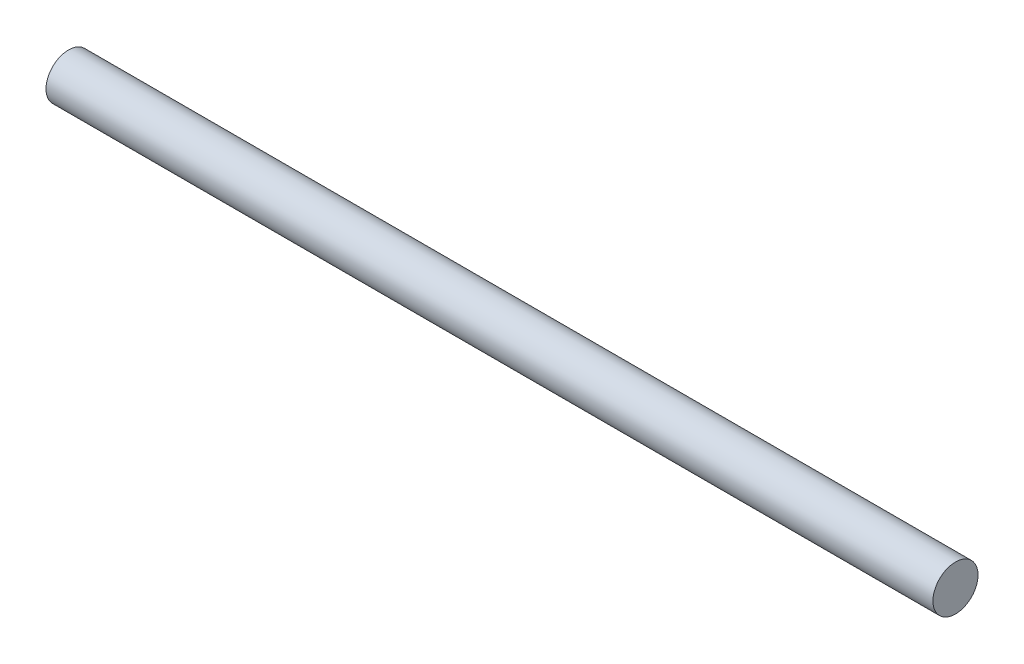
ISO-10303-21;
HEADER;
FILE_DESCRIPTION(('STEP AP214'),'2;1');
FILE_NAME('part.step','',(''),(''),'','','');
FILE_SCHEMA(('AUTOMOTIVE_DESIGN { 1 0 10303 214 1 1 1 1 }'));
ENDSEC;
DATA;
#1=APPLICATION_CONTEXT('core data for automotive mechanical design processes');
#2=APPLICATION_PROTOCOL_DEFINITION('international standard','automotive_design',2000,#1);
#3=PRODUCT_CONTEXT('',#1,'mechanical');
#4=PRODUCT('Part','Part','',(#3));
#5=PRODUCT_RELATED_PRODUCT_CATEGORY('part','',(#4));
#6=PRODUCT_DEFINITION_FORMATION('','',#4);
#7=PRODUCT_DEFINITION_CONTEXT('part definition',#1,'design');
#8=PRODUCT_DEFINITION('design','',#6,#7);
#9=PRODUCT_DEFINITION_SHAPE('','',#8);
#10=(LENGTH_UNIT() NAMED_UNIT(*) SI_UNIT(.MILLI.,.METRE.));
#11=(NAMED_UNIT(*) PLANE_ANGLE_UNIT() SI_UNIT($,.RADIAN.));
#12=(NAMED_UNIT(*) SI_UNIT($,.STERADIAN.) SOLID_ANGLE_UNIT());
#13=UNCERTAINTY_MEASURE_WITH_UNIT(LENGTH_MEASURE(1.E-05),#10,'distance_accuracy_value','');
#14=(GEOMETRIC_REPRESENTATION_CONTEXT(3) GLOBAL_UNCERTAINTY_ASSIGNED_CONTEXT((#13)) GLOBAL_UNIT_ASSIGNED_CONTEXT((#10,
#11,#12)) REPRESENTATION_CONTEXT('',''));
#15=CARTESIAN_POINT('',(0.,0.,0.));
#16=DIRECTION('',(0.,0.,1.));
#17=DIRECTION('',(1.,0.,0.));
#18=AXIS2_PLACEMENT_3D('',#15,#16,#17);
#19=CARTESIAN_POINT('',(187.24,0.,0.));
#20=DIRECTION('',(-1.,0.,0.));
#21=DIRECTION('',(0.,0.,1.));
#22=AXIS2_PLACEMENT_3D('',#19,#20,#21);
#23=CYLINDRICAL_SURFACE('',#22,4.7625);
#24=CARTESIAN_POINT('',(187.24,0.,0.));
#25=DIRECTION('',(1.,0.,0.));
#26=DIRECTION('',(0.,0.,-1.));
#27=AXIS2_PLACEMENT_3D('',#24,#25,#26);
#28=CIRCLE('',#27,4.7625);
#29=CARTESIAN_POINT('',(187.24,0.,4.7625));
#30=VERTEX_POINT('',#29);
#31=EDGE_CURVE('E10',#30,#30,#28,.T.);
#32=CARTESIAN_POINT('',(0.,0.,0.));
#33=DIRECTION('',(1.,0.,0.));
#34=DIRECTION('',(0.,0.,-1.));
#35=AXIS2_PLACEMENT_3D('',#32,#33,#34);
#36=CIRCLE('',#35,4.7625);
#37=CARTESIAN_POINT('',(0.,0.,4.7625));
#38=VERTEX_POINT('',#37);
#39=EDGE_CURVE('E42',#38,#38,#36,.T.);
#40=CARTESIAN_POINT('',(187.24,0.,4.7625));
#41=CARTESIAN_POINT('',(185.289583333333,0.,4.7625));
#42=CARTESIAN_POINT('',(183.339166666667,0.,4.7625));
#43=CARTESIAN_POINT('',(179.438333333333,0.,4.7625));
#44=CARTESIAN_POINT('',(177.487916666667,0.,4.7625));
#45=CARTESIAN_POINT('',(173.587083333333,0.,4.7625));
#46=CARTESIAN_POINT('',(171.636666666667,0.,4.7625));
#47=CARTESIAN_POINT('',(167.735833333333,0.,4.7625));
#48=CARTESIAN_POINT('',(165.785416666667,0.,4.7625));
#49=CARTESIAN_POINT('',(161.884583333333,0.,4.7625));
#50=CARTESIAN_POINT('',(159.934166666667,0.,4.7625));
#51=CARTESIAN_POINT('',(156.033333333333,0.,4.7625));
#52=CARTESIAN_POINT('',(154.082916666667,0.,4.7625));
#53=CARTESIAN_POINT('',(150.182083333333,0.,4.7625));
#54=CARTESIAN_POINT('',(148.231666666667,0.,4.7625));
#55=CARTESIAN_POINT('',(144.330833333333,0.,4.7625));
#56=CARTESIAN_POINT('',(142.380416666667,0.,4.7625));
#57=CARTESIAN_POINT('',(138.479583333333,0.,4.7625));
#58=CARTESIAN_POINT('',(136.529166666667,0.,4.7625));
#59=CARTESIAN_POINT('',(132.628333333333,0.,4.7625));
#60=CARTESIAN_POINT('',(130.677916666667,0.,4.7625));
#61=CARTESIAN_POINT('',(126.777083333333,0.,4.7625));
#62=CARTESIAN_POINT('',(124.826666666667,0.,4.7625));
#63=CARTESIAN_POINT('',(120.925833333333,0.,4.7625));
#64=CARTESIAN_POINT('',(118.975416666667,0.,4.7625));
#65=CARTESIAN_POINT('',(115.074583333333,0.,4.7625));
#66=CARTESIAN_POINT('',(113.124166666667,0.,4.7625));
#67=CARTESIAN_POINT('',(109.223333333333,0.,4.7625));
#68=CARTESIAN_POINT('',(107.272916666667,0.,4.7625));
#69=CARTESIAN_POINT('',(103.372083333333,0.,4.7625));
#70=CARTESIAN_POINT('',(101.421666666667,0.,4.7625));
#71=CARTESIAN_POINT('',(97.5208333333333,0.,4.7625));
#72=CARTESIAN_POINT('',(95.5704166666666,0.,4.7625));
#73=CARTESIAN_POINT('',(91.6695833333333,0.,4.7625));
#74=CARTESIAN_POINT('',(89.7191666666666,0.,4.7625));
#75=CARTESIAN_POINT('',(85.8183333333333,0.,4.7625));
#76=CARTESIAN_POINT('',(83.8679166666666,0.,4.7625));
#77=CARTESIAN_POINT('',(79.9670833333333,0.,4.7625));
#78=CARTESIAN_POINT('',(78.0166666666666,0.,4.7625));
#79=CARTESIAN_POINT('',(74.1158333333333,0.,4.7625));
#80=CARTESIAN_POINT('',(72.1654166666666,0.,4.7625));
#81=CARTESIAN_POINT('',(68.2645833333333,0.,4.7625));
#82=CARTESIAN_POINT('',(66.3141666666666,0.,4.7625));
#83=CARTESIAN_POINT('',(62.4133333333333,0.,4.7625));
#84=CARTESIAN_POINT('',(60.4629166666667,0.,4.7625));
#85=CARTESIAN_POINT('',(56.5620833333333,0.,4.7625));
#86=CARTESIAN_POINT('',(54.6116666666667,0.,4.7625));
#87=CARTESIAN_POINT('',(50.7108333333333,0.,4.7625));
#88=CARTESIAN_POINT('',(48.7604166666667,0.,4.7625));
#89=CARTESIAN_POINT('',(44.8595833333333,0.,4.7625));
#90=CARTESIAN_POINT('',(42.9091666666667,0.,4.7625));
#91=CARTESIAN_POINT('',(39.0083333333333,0.,4.7625));
#92=CARTESIAN_POINT('',(37.0579166666667,0.,4.7625));
#93=CARTESIAN_POINT('',(33.1570833333333,0.,4.7625));
#94=CARTESIAN_POINT('',(31.2066666666666,0.,4.7625));
#95=CARTESIAN_POINT('',(27.3058333333333,0.,4.7625));
#96=CARTESIAN_POINT('',(25.3554166666666,0.,4.7625));
#97=CARTESIAN_POINT('',(21.4545833333333,0.,4.7625));
#98=CARTESIAN_POINT('',(19.5041666666666,0.,4.7625));
#99=CARTESIAN_POINT('',(15.6033333333333,0.,4.7625));
#100=CARTESIAN_POINT('',(13.6529166666666,0.,4.7625));
#101=CARTESIAN_POINT('',(9.75208333333331,0.,4.7625));
#102=CARTESIAN_POINT('',(7.80166666666664,0.,4.7625));
#103=CARTESIAN_POINT('',(3.90083333333331,0.,4.7625));
#104=CARTESIAN_POINT('',(1.95041666666664,0.,4.7625));
#105=CARTESIAN_POINT('',(0.,0.,4.7625));
#106=B_SPLINE_CURVE_WITH_KNOTS('',3,(#40,#41,#42,#43,#44,#45,#46,#47,#48,#49,#50,#51,#52,#53,
#54,#55,#56,#57,#58,#59,#60,#61,#62,#63,#64,#65,#66,#67,#68,#69,#70,#71,#72,#73,#74,#75,#76,#77,
#78,#79,#80,#81,#82,#83,#84,#85,#86,#87,#88,#89,#90,#91,#92,#93,#94,#95,#96,#97,#98,#99,#100,
#101,#102,#103,#104,#105),.UNSPECIFIED.,.F.,.F.,(4,2,2,2,2,2,2,2,2,2,2,2,2,2,2,2,2,2,2,2,2,2,2,
2,2,2,2,2,2,2,2,2,4),(0.,5.85125,11.7025,17.55375,23.405,29.25625,35.1075,40.95875,46.81,
52.66125,58.5125,64.36375,70.215,76.06625,81.9175,87.76875,93.62,99.47125,105.3225,111.17375,
117.025,122.87625,128.7275,134.57875,140.43,146.28125,152.1325,157.98375,163.835,169.68625,
175.5375,181.38875,187.24),.UNSPECIFIED.);
#107=EDGE_CURVE('BSEAM39',#30,#38,#106,.T.);
#108=ORIENTED_EDGE('',*,*,#31,.F.);
#109=ORIENTED_EDGE('',*,*,#39,.T.);
#110=ORIENTED_EDGE('',*,*,#107,.T.);
#111=ORIENTED_EDGE('',*,*,#107,.F.);
#112=EDGE_LOOP('',(#108,#110,#109,#111));
#113=FACE_BOUND('',#112,.T.);
#114=ADVANCED_FACE('F39',(#113),#23,.T.);
#115=CARTESIAN_POINT('',(187.24,0.,0.));
#116=DIRECTION('',(1.,0.,0.));
#117=DIRECTION('',(0.,0.,-1.));
#118=AXIS2_PLACEMENT_3D('',#115,#116,#117);
#119=PLANE('',#118);
#120=ORIENTED_EDGE('',*,*,#31,.T.);
#121=EDGE_LOOP('',(#120));
#122=FACE_BOUND('',#121,.T.);
#123=ADVANCED_FACE('F54',(#122),#119,.T.);
#124=CARTESIAN_POINT('',(0.,0.,0.));
#125=DIRECTION('',(1.,0.,0.));
#126=DIRECTION('',(0.,0.,-1.));
#127=AXIS2_PLACEMENT_3D('',#124,#125,#126);
#128=PLANE('',#127);
#129=ORIENTED_EDGE('',*,*,#39,.F.);
#130=EDGE_LOOP('',(#129));
#131=FACE_BOUND('',#130,.T.);
#132=ADVANCED_FACE('F52',(#131),#128,.F.);
#133=CLOSED_SHELL('',(#114,#123,#132));
#134=MANIFOLD_SOLID_BREP('B2',#133);
#135=ADVANCED_BREP_SHAPE_REPRESENTATION('',(#18,#134),#14);
#136=SHAPE_DEFINITION_REPRESENTATION(#9,#135);
ENDSEC;
END-ISO-10303-21;
